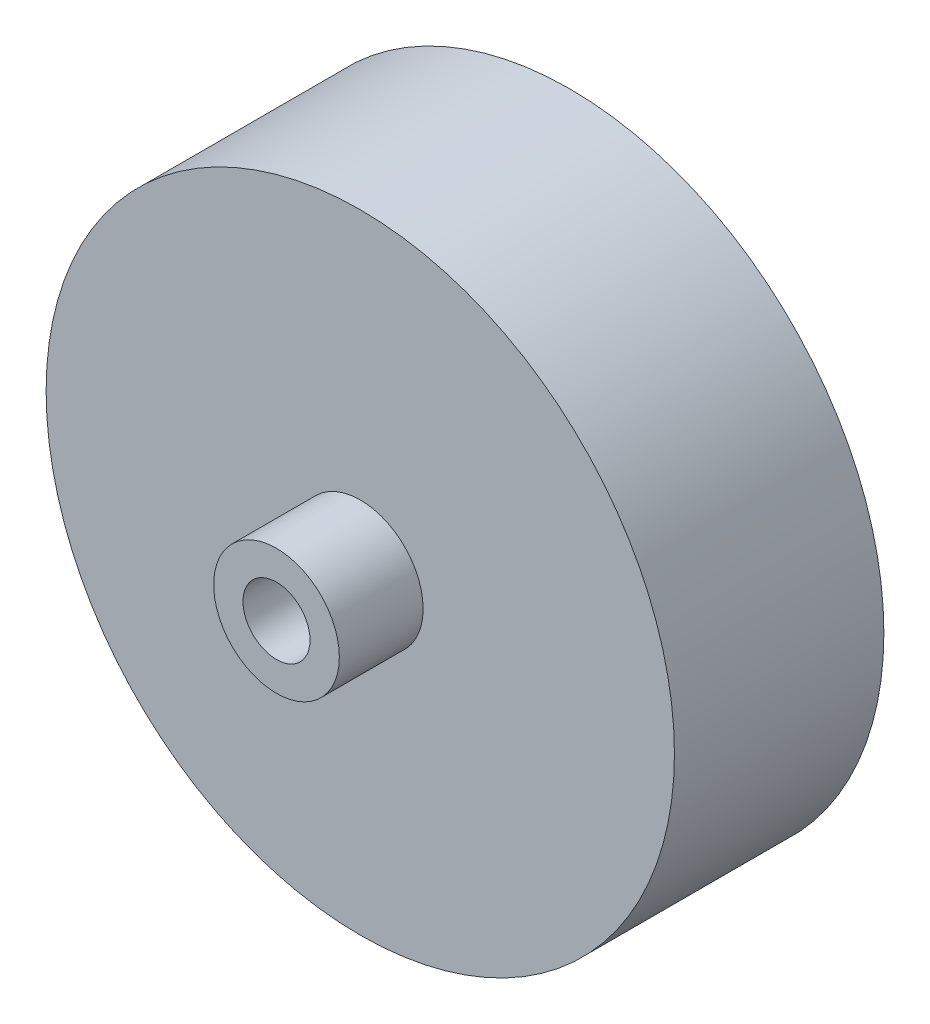
ISO-10303-21;
HEADER;
FILE_DESCRIPTION(('STEP AP214'),'2;1');
FILE_NAME('part.step','',(''),(''),'','','');
FILE_SCHEMA(('AUTOMOTIVE_DESIGN { 1 0 10303 214 1 1 1 1 }'));
ENDSEC;
DATA;
#1=APPLICATION_CONTEXT('core data for automotive mechanical design processes');
#2=APPLICATION_PROTOCOL_DEFINITION('international standard','automotive_design',2000,#1);
#3=PRODUCT_CONTEXT('',#1,'mechanical');
#4=PRODUCT('Part','Part','',(#3));
#5=PRODUCT_RELATED_PRODUCT_CATEGORY('part','',(#4));
#6=PRODUCT_DEFINITION_FORMATION('','',#4);
#7=PRODUCT_DEFINITION_CONTEXT('part definition',#1,'design');
#8=PRODUCT_DEFINITION('design','',#6,#7);
#9=PRODUCT_DEFINITION_SHAPE('','',#8);
#10=(LENGTH_UNIT() NAMED_UNIT(*) SI_UNIT(.MILLI.,.METRE.));
#11=(NAMED_UNIT(*) PLANE_ANGLE_UNIT() SI_UNIT($,.RADIAN.));
#12=(NAMED_UNIT(*) SI_UNIT($,.STERADIAN.) SOLID_ANGLE_UNIT());
#13=UNCERTAINTY_MEASURE_WITH_UNIT(LENGTH_MEASURE(1.E-05),#10,'distance_accuracy_value','');
#14=(GEOMETRIC_REPRESENTATION_CONTEXT(3) GLOBAL_UNCERTAINTY_ASSIGNED_CONTEXT((#13)) GLOBAL_UNIT_ASSIGNED_CONTEXT((#10,
#11,#12)) REPRESENTATION_CONTEXT('',''));
#15=CARTESIAN_POINT('',(0.,0.,0.));
#16=DIRECTION('',(0.,0.,1.));
#17=DIRECTION('',(1.,0.,0.));
#18=AXIS2_PLACEMENT_3D('',#15,#16,#17);
#19=CARTESIAN_POINT('',(0.,0.,25.));
#20=DIRECTION('',(0.,0.,-1.));
#21=DIRECTION('',(-1.,0.,0.));
#22=AXIS2_PLACEMENT_3D('',#19,#20,#21);
#23=CYLINDRICAL_SURFACE('',#22,37.5);
#24=CARTESIAN_POINT('',(0.,0.,25.));
#25=DIRECTION('',(0.,0.,1.));
#26=DIRECTION('',(1.,0.,0.));
#27=AXIS2_PLACEMENT_3D('',#24,#25,#26);
#28=CIRCLE('',#27,37.5);
#29=CARTESIAN_POINT('',(37.5,0.,25.));
#30=VERTEX_POINT('',#29);
#31=EDGE_CURVE('E44',#30,#30,#28,.T.);
#32=ORIENTED_EDGE('',*,*,#31,.F.);
#33=EDGE_LOOP('',(#32));
#34=FACE_BOUND('',#33,.T.);
#35=CARTESIAN_POINT('',(0.,0.,0.));
#36=DIRECTION('',(0.,0.,1.));
#37=DIRECTION('',(1.,0.,0.));
#38=AXIS2_PLACEMENT_3D('',#35,#36,#37);
#39=CIRCLE('',#38,37.5);
#40=CARTESIAN_POINT('',(37.5,0.,0.));
#41=VERTEX_POINT('',#40);
#42=EDGE_CURVE('E40',#41,#41,#39,.T.);
#43=ORIENTED_EDGE('',*,*,#42,.T.);
#44=EDGE_LOOP('',(#43));
#45=FACE_BOUND('',#44,.T.);
#46=ADVANCED_FACE('F37',(#34,#45),#23,.T.);
#47=CARTESIAN_POINT('',(0.,0.,25.));
#48=DIRECTION('',(0.,0.,1.));
#49=DIRECTION('',(1.,0.,0.));
#50=AXIS2_PLACEMENT_3D('',#47,#48,#49);
#51=PLANE('',#50);
#52=CARTESIAN_POINT('',(0.,0.,25.));
#53=DIRECTION('',(0.,0.,1.));
#54=DIRECTION('',(1.,0.,0.));
#55=AXIS2_PLACEMENT_3D('',#52,#53,#54);
#56=CIRCLE('',#55,7.5);
#57=CARTESIAN_POINT('',(7.5,0.,25.));
#58=VERTEX_POINT('',#57);
#59=EDGE_CURVE('E10',#58,#58,#56,.T.);
#60=ORIENTED_EDGE('',*,*,#59,.F.);
#61=EDGE_LOOP('',(#60));
#62=FACE_BOUND('',#61,.T.);
#63=ORIENTED_EDGE('',*,*,#31,.T.);
#64=EDGE_LOOP('',(#63));
#65=FACE_BOUND('',#64,.T.);
#66=ADVANCED_FACE('F76',(#62,#65),#51,.T.);
#67=CARTESIAN_POINT('',(0.,0.,0.));
#68=DIRECTION('',(0.,0.,1.));
#69=DIRECTION('',(1.,0.,0.));
#70=AXIS2_PLACEMENT_3D('',#67,#68,#69);
#71=PLANE('',#70);
#72=ORIENTED_EDGE('',*,*,#42,.F.);
#73=EDGE_LOOP('',(#72));
#74=FACE_BOUND('',#73,.T.);
#75=ADVANCED_FACE('F66',(#74),#71,.F.);
#76=CARTESIAN_POINT('',(0.,0.,35.));
#77=DIRECTION('',(0.,0.,1.));
#78=DIRECTION('',(1.,0.,0.));
#79=AXIS2_PLACEMENT_3D('',#76,#77,#78);
#80=PLANE('',#79);
#81=CARTESIAN_POINT('',(0.,0.,35.));
#82=DIRECTION('',(0.,0.,1.));
#83=DIRECTION('',(1.,0.,0.));
#84=AXIS2_PLACEMENT_3D('',#81,#82,#83);
#85=CIRCLE('',#84,7.5);
#86=CARTESIAN_POINT('',(7.5,0.,35.));
#87=VERTEX_POINT('',#86);
#88=EDGE_CURVE('E50',#87,#87,#85,.T.);
#89=ORIENTED_EDGE('',*,*,#88,.T.);
#90=EDGE_LOOP('',(#89));
#91=FACE_BOUND('',#90,.T.);
#92=CARTESIAN_POINT('',(0.,0.,35.));
#93=DIRECTION('',(0.,0.,1.));
#94=DIRECTION('',(1.,0.,0.));
#95=AXIS2_PLACEMENT_3D('',#92,#93,#94);
#96=CIRCLE('',#95,4.);
#97=CARTESIAN_POINT('',(4.,0.,35.));
#98=VERTEX_POINT('',#97);
#99=EDGE_CURVE('E53',#98,#98,#96,.T.);
#100=ORIENTED_EDGE('',*,*,#99,.F.);
#101=EDGE_LOOP('',(#100));
#102=FACE_BOUND('',#101,.T.);
#103=ADVANCED_FACE('F63',(#91,#102),#80,.T.);
#104=CARTESIAN_POINT('',(0.,0.,35.));
#105=DIRECTION('',(0.,0.,-1.));
#106=DIRECTION('',(-1.,0.,0.));
#107=AXIS2_PLACEMENT_3D('',#104,#105,#106);
#108=CYLINDRICAL_SURFACE('',#107,7.5);
#109=ORIENTED_EDGE('',*,*,#88,.F.);
#110=EDGE_LOOP('',(#109));
#111=FACE_BOUND('',#110,.T.);
#112=ORIENTED_EDGE('',*,*,#59,.T.);
#113=EDGE_LOOP('',(#112));
#114=FACE_BOUND('',#113,.T.);
#115=ADVANCED_FACE('F65',(#111,#114),#108,.T.);
#116=CARTESIAN_POINT('',(0.,0.,35.));
#117=DIRECTION('',(0.,0.,-1.));
#118=DIRECTION('',(-1.,0.,0.));
#119=AXIS2_PLACEMENT_3D('',#116,#117,#118);
#120=CYLINDRICAL_SURFACE('',#119,4.);
#121=ORIENTED_EDGE('',*,*,#99,.T.);
#122=EDGE_LOOP('',(#121));
#123=FACE_BOUND('',#122,.T.);
#124=CARTESIAN_POINT('',(0.,0.,25.));
#125=DIRECTION('',(0.,0.,1.));
#126=DIRECTION('',(1.,0.,0.));
#127=AXIS2_PLACEMENT_3D('',#124,#125,#126);
#128=CIRCLE('',#127,4.);
#129=CARTESIAN_POINT('',(4.,0.,25.));
#130=VERTEX_POINT('',#129);
#131=EDGE_CURVE('E54',#130,#130,#128,.T.);
#132=ORIENTED_EDGE('',*,*,#131,.F.);
#133=EDGE_LOOP('',(#132));
#134=FACE_BOUND('',#133,.T.);
#135=ADVANCED_FACE('F60',(#123,#134),#120,.F.);
#136=ORIENTED_EDGE('',*,*,#131,.T.);
#137=EDGE_LOOP('',(#136));
#138=FACE_BOUND('',#137,.T.);
#139=ADVANCED_FACE('F85',(#138),#51,.T.);
#140=CLOSED_SHELL('',(#46,#66,#75,#103,#115,#135,#139));
#141=MANIFOLD_SOLID_BREP('B2',#140);
#142=ADVANCED_BREP_SHAPE_REPRESENTATION('',(#18,#141),#14);
#143=SHAPE_DEFINITION_REPRESENTATION(#9,#142);
ENDSEC;
END-ISO-10303-21;
